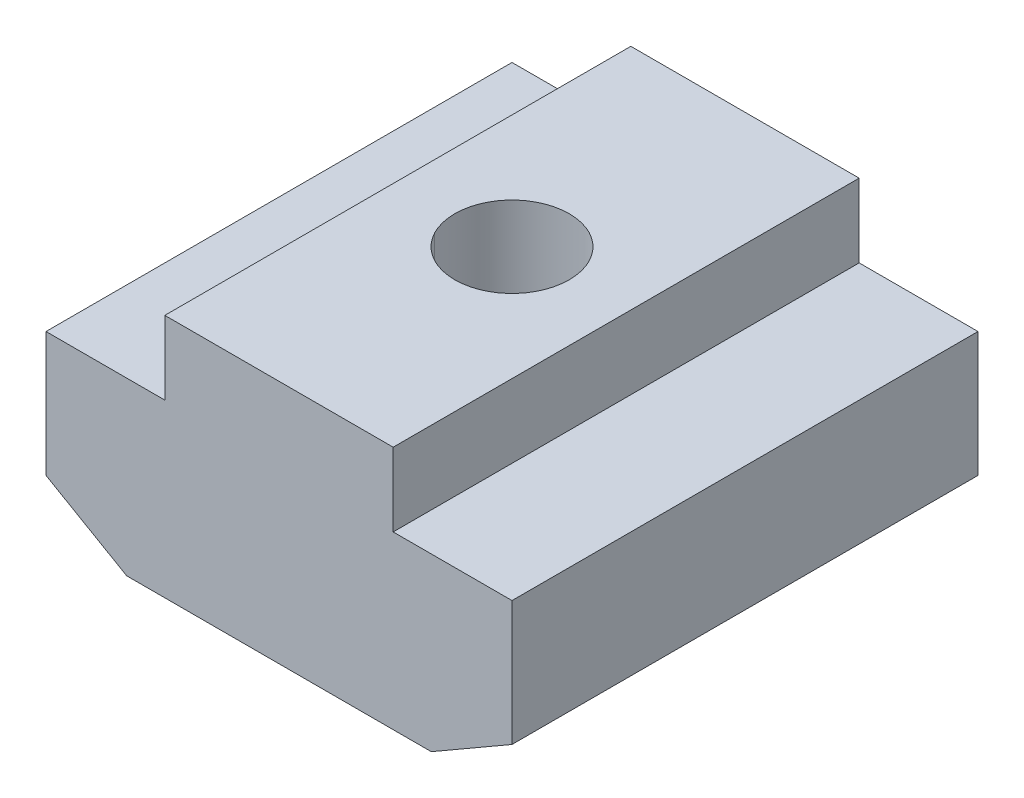
ISO-10303-21;
HEADER;
FILE_DESCRIPTION(('STEP AP214'),'2;1');
FILE_NAME('part.step','',(''),(''),'','','');
FILE_SCHEMA(('AUTOMOTIVE_DESIGN { 1 0 10303 214 1 1 1 1 }'));
ENDSEC;
DATA;
#1=APPLICATION_CONTEXT('core data for automotive mechanical design processes');
#2=APPLICATION_PROTOCOL_DEFINITION('international standard','automotive_design',2000,#1);
#3=PRODUCT_CONTEXT('',#1,'mechanical');
#4=PRODUCT('Part','Part','',(#3));
#5=PRODUCT_RELATED_PRODUCT_CATEGORY('part','',(#4));
#6=PRODUCT_DEFINITION_FORMATION('','',#4);
#7=PRODUCT_DEFINITION_CONTEXT('part definition',#1,'design');
#8=PRODUCT_DEFINITION('design','',#6,#7);
#9=PRODUCT_DEFINITION_SHAPE('','',#8);
#10=(LENGTH_UNIT() NAMED_UNIT(*) SI_UNIT(.MILLI.,.METRE.));
#11=(NAMED_UNIT(*) PLANE_ANGLE_UNIT() SI_UNIT($,.RADIAN.));
#12=(NAMED_UNIT(*) SI_UNIT($,.STERADIAN.) SOLID_ANGLE_UNIT());
#13=UNCERTAINTY_MEASURE_WITH_UNIT(LENGTH_MEASURE(1.E-05),#10,'distance_accuracy_value','');
#14=(GEOMETRIC_REPRESENTATION_CONTEXT(3) GLOBAL_UNCERTAINTY_ASSIGNED_CONTEXT((#13)) GLOBAL_UNIT_ASSIGNED_CONTEXT((#10,
#11,#12)) REPRESENTATION_CONTEXT('',''));
#15=CARTESIAN_POINT('',(0.,0.,0.));
#16=DIRECTION('',(0.,0.,1.));
#17=DIRECTION('',(1.,0.,0.));
#18=AXIS2_PLACEMENT_3D('',#15,#16,#17);
#19=CARTESIAN_POINT('',(-10.,-1.675,0.));
#20=DIRECTION('',(0.50000000000019,0.866025403784329,0.));
#21=DIRECTION('',(0.,0.,-1.));
#22=AXIS2_PLACEMENT_3D('',#19,#20,#21);
#23=PLANE('',#22);
#24=DIRECTION('',(0.,0.,1.));
#25=VECTOR('',#24,1.);
#26=CARTESIAN_POINT('',(-10.,-1.675,0.));
#27=LINE('',#26,#25);
#28=CARTESIAN_POINT('',(-10.,-1.675,-10.));
#29=VERTEX_POINT('',#28);
#30=CARTESIAN_POINT('',(-10.,-1.675,10.));
#31=VERTEX_POINT('',#30);
#32=EDGE_CURVE('E258',#29,#31,#27,.T.);
#33=ORIENTED_EDGE('',*,*,#32,.F.);
#34=DIRECTION('',(0.866025403784329,-0.50000000000019,0.));
#35=VECTOR('',#34,1.);
#36=CARTESIAN_POINT('',(-8.26794919243,-2.675,-10.));
#37=LINE('',#36,#35);
#38=CARTESIAN_POINT('',(-6.53589838486,-3.675,-10.));
#39=VERTEX_POINT('',#38);
#40=EDGE_CURVE('E246',#29,#39,#37,.T.);
#41=ORIENTED_EDGE('',*,*,#40,.T.);
#42=DIRECTION('',(0.,0.,1.));
#43=VECTOR('',#42,1.);
#44=CARTESIAN_POINT('',(-6.53589838486,-3.675,0.));
#45=LINE('',#44,#43);
#46=CARTESIAN_POINT('',(-6.53589838486,-3.675,10.));
#47=VERTEX_POINT('',#46);
#48=EDGE_CURVE('E12',#39,#47,#45,.T.);
#49=ORIENTED_EDGE('',*,*,#48,.T.);
#50=DIRECTION('',(-0.866025403784329,0.50000000000019,0.));
#51=VECTOR('',#50,1.);
#52=CARTESIAN_POINT('',(-8.26794919243,-2.675,10.));
#53=LINE('',#52,#51);
#54=EDGE_CURVE('E30',#47,#31,#53,.T.);
#55=ORIENTED_EDGE('',*,*,#54,.T.);
#56=EDGE_LOOP('',(#33,#41,#49,#55));
#57=FACE_BOUND('',#56,.T.);
#58=ADVANCED_FACE('F20',(#57),#23,.F.);
#59=CARTESIAN_POINT('',(10.,-3.675,0.));
#60=DIRECTION('',(0.,1.,0.));
#61=DIRECTION('',(1.,0.,0.));
#62=AXIS2_PLACEMENT_3D('',#59,#60,#61);
#63=PLANE('',#62);
#64=CARTESIAN_POINT('',(0.,-3.675,0.));
#65=DIRECTION('',(0.,1.,0.));
#66=DIRECTION('',(1.,0.,0.));
#67=AXIS2_PLACEMENT_3D('',#64,#65,#66);
#68=CIRCLE('',#67,3.3235);
#69=CARTESIAN_POINT('',(-3.3235,-3.675,0.));
#70=VERTEX_POINT('',#69);
#71=CARTESIAN_POINT('',(3.3235,-3.675,0.));
#72=VERTEX_POINT('',#71);
#73=EDGE_CURVE('E206',#70,#72,#68,.T.);
#74=ORIENTED_EDGE('',*,*,#73,.T.);
#75=CARTESIAN_POINT('',(0.,-3.675,0.));
#76=DIRECTION('',(0.,1.,0.));
#77=DIRECTION('',(1.,0.,0.));
#78=AXIS2_PLACEMENT_3D('',#75,#76,#77);
#79=CIRCLE('',#78,3.3235);
#80=EDGE_CURVE('E177',#72,#70,#79,.T.);
#81=ORIENTED_EDGE('',*,*,#80,.T.);
#82=EDGE_LOOP('',(#74,#81));
#83=FACE_BOUND('',#82,.T.);
#84=ORIENTED_EDGE('',*,*,#48,.F.);
#85=DIRECTION('',(1.,0.,0.));
#86=VECTOR('',#85,1.);
#87=CARTESIAN_POINT('',(0.,-3.675,-10.));
#88=LINE('',#87,#86);
#89=CARTESIAN_POINT('',(6.53589838486,-3.675,-10.));
#90=VERTEX_POINT('',#89);
#91=EDGE_CURVE('E244',#39,#90,#88,.T.);
#92=ORIENTED_EDGE('',*,*,#91,.T.);
#93=DIRECTION('',(0.,0.,1.));
#94=VECTOR('',#93,1.);
#95=CARTESIAN_POINT('',(6.53589838486,-3.675,0.));
#96=LINE('',#95,#94);
#97=CARTESIAN_POINT('',(6.53589838486,-3.675,10.));
#98=VERTEX_POINT('',#97);
#99=EDGE_CURVE('E267',#90,#98,#96,.T.);
#100=ORIENTED_EDGE('',*,*,#99,.T.);
#101=DIRECTION('',(1.,0.,0.));
#102=VECTOR('',#101,1.);
#103=CARTESIAN_POINT('',(0.,-3.675,10.));
#104=LINE('',#103,#102);
#105=EDGE_CURVE('E240',#47,#98,#104,.T.);
#106=ORIENTED_EDGE('',*,*,#105,.F.);
#107=EDGE_LOOP('',(#84,#92,#100,#106));
#108=FACE_BOUND('',#107,.T.);
#109=ADVANCED_FACE('F223',(#83,#108),#63,.F.);
#110=CARTESIAN_POINT('',(0.,0.,10.));
#111=DIRECTION('',(0.,0.,1.));
#112=DIRECTION('',(1.,0.,0.));
#113=AXIS2_PLACEMENT_3D('',#110,#111,#112);
#114=PLANE('',#113);
#115=ORIENTED_EDGE('',*,*,#105,.T.);
#116=DIRECTION('',(-0.866025403784329,-0.50000000000019,0.));
#117=VECTOR('',#116,1.);
#118=CARTESIAN_POINT('',(8.26794919243,-2.675,10.));
#119=LINE('',#118,#117);
#120=CARTESIAN_POINT('',(10.,-1.675,10.));
#121=VERTEX_POINT('',#120);
#122=EDGE_CURVE('E263',#121,#98,#119,.T.);
#123=ORIENTED_EDGE('',*,*,#122,.F.);
#124=DIRECTION('',(0.,1.,0.));
#125=VECTOR('',#124,1.);
#126=CARTESIAN_POINT('',(10.,1.,10.));
#127=LINE('',#126,#125);
#128=CARTESIAN_POINT('',(10.,3.675,10.));
#129=VERTEX_POINT('',#128);
#130=EDGE_CURVE('E272',#121,#129,#127,.T.);
#131=ORIENTED_EDGE('',*,*,#130,.T.);
#132=DIRECTION('',(-1.,0.,0.));
#133=VECTOR('',#132,1.);
#134=CARTESIAN_POINT('',(7.45,3.675,10.));
#135=LINE('',#134,#133);
#136=CARTESIAN_POINT('',(4.9,3.675,10.));
#137=VERTEX_POINT('',#136);
#138=EDGE_CURVE('E199',#129,#137,#135,.T.);
#139=ORIENTED_EDGE('',*,*,#138,.T.);
#140=DIRECTION('',(0.,1.,0.));
#141=VECTOR('',#140,1.);
#142=CARTESIAN_POINT('',(4.9,5.25,10.));
#143=LINE('',#142,#141);
#144=CARTESIAN_POINT('',(4.9,6.825,10.));
#145=VERTEX_POINT('',#144);
#146=EDGE_CURVE('E284',#137,#145,#143,.T.);
#147=ORIENTED_EDGE('',*,*,#146,.T.);
#148=DIRECTION('',(-1.,0.,0.));
#149=VECTOR('',#148,1.);
#150=CARTESIAN_POINT('',(0.,6.825,10.));
#151=LINE('',#150,#149);
#152=CARTESIAN_POINT('',(-4.9,6.825,10.));
#153=VERTEX_POINT('',#152);
#154=EDGE_CURVE('E278',#145,#153,#151,.T.);
#155=ORIENTED_EDGE('',*,*,#154,.T.);
#156=DIRECTION('',(0.,-1.,0.));
#157=VECTOR('',#156,1.);
#158=CARTESIAN_POINT('',(-4.9,5.25,10.));
#159=LINE('',#158,#157);
#160=CARTESIAN_POINT('',(-4.9,3.675,10.));
#161=VERTEX_POINT('',#160);
#162=EDGE_CURVE('E298',#153,#161,#159,.T.);
#163=ORIENTED_EDGE('',*,*,#162,.T.);
#164=DIRECTION('',(-1.,0.,0.));
#165=VECTOR('',#164,1.);
#166=CARTESIAN_POINT('',(-7.45,3.675,10.));
#167=LINE('',#166,#165);
#168=CARTESIAN_POINT('',(-10.,3.675,10.));
#169=VERTEX_POINT('',#168);
#170=EDGE_CURVE('E308',#161,#169,#167,.T.);
#171=ORIENTED_EDGE('',*,*,#170,.T.);
#172=DIRECTION('',(0.,-1.,0.));
#173=VECTOR('',#172,1.);
#174=CARTESIAN_POINT('',(-10.,1.,10.));
#175=LINE('',#174,#173);
#176=EDGE_CURVE('E254',#169,#31,#175,.T.);
#177=ORIENTED_EDGE('',*,*,#176,.T.);
#178=ORIENTED_EDGE('',*,*,#54,.F.);
#179=EDGE_LOOP('',(#115,#123,#131,#139,#147,#155,#163,#171,#177,#178));
#180=FACE_BOUND('',#179,.T.);
#181=ADVANCED_FACE('F467',(#180),#114,.T.);
#182=CARTESIAN_POINT('',(0.,0.,-10.));
#183=DIRECTION('',(0.,0.,1.));
#184=DIRECTION('',(1.,0.,0.));
#185=AXIS2_PLACEMENT_3D('',#182,#183,#184);
#186=PLANE('',#185);
#187=ORIENTED_EDGE('',*,*,#40,.F.);
#188=DIRECTION('',(0.,-1.,0.));
#189=VECTOR('',#188,1.);
#190=CARTESIAN_POINT('',(-10.,1.,-10.));
#191=LINE('',#190,#189);
#192=CARTESIAN_POINT('',(-10.,3.675,-10.));
#193=VERTEX_POINT('',#192);
#194=EDGE_CURVE('E250',#193,#29,#191,.T.);
#195=ORIENTED_EDGE('',*,*,#194,.F.);
#196=DIRECTION('',(-1.,0.,0.));
#197=VECTOR('',#196,1.);
#198=CARTESIAN_POINT('',(-7.45,3.675,-10.));
#199=LINE('',#198,#197);
#200=CARTESIAN_POINT('',(-4.9,3.675,-10.));
#201=VERTEX_POINT('',#200);
#202=EDGE_CURVE('E316',#201,#193,#199,.T.);
#203=ORIENTED_EDGE('',*,*,#202,.F.);
#204=DIRECTION('',(0.,-1.,0.));
#205=VECTOR('',#204,1.);
#206=CARTESIAN_POINT('',(-4.9,5.25,-10.));
#207=LINE('',#206,#205);
#208=CARTESIAN_POINT('',(-4.9,6.825,-10.));
#209=VERTEX_POINT('',#208);
#210=EDGE_CURVE('E301',#209,#201,#207,.T.);
#211=ORIENTED_EDGE('',*,*,#210,.F.);
#212=DIRECTION('',(-1.,0.,0.));
#213=VECTOR('',#212,1.);
#214=CARTESIAN_POINT('',(0.,6.825,-10.));
#215=LINE('',#214,#213);
#216=CARTESIAN_POINT('',(4.9,6.825,-10.));
#217=VERTEX_POINT('',#216);
#218=EDGE_CURVE('E281',#217,#209,#215,.T.);
#219=ORIENTED_EDGE('',*,*,#218,.F.);
#220=DIRECTION('',(0.,1.,0.));
#221=VECTOR('',#220,1.);
#222=CARTESIAN_POINT('',(4.9,5.25,-10.));
#223=LINE('',#222,#221);
#224=CARTESIAN_POINT('',(4.9,3.675,-10.));
#225=VERTEX_POINT('',#224);
#226=EDGE_CURVE('E292',#225,#217,#223,.T.);
#227=ORIENTED_EDGE('',*,*,#226,.F.);
#228=DIRECTION('',(-1.,0.,0.));
#229=VECTOR('',#228,1.);
#230=CARTESIAN_POINT('',(7.45,3.675,-10.));
#231=LINE('',#230,#229);
#232=CARTESIAN_POINT('',(10.,3.675,-10.));
#233=VERTEX_POINT('',#232);
#234=EDGE_CURVE('E200',#233,#225,#231,.T.);
#235=ORIENTED_EDGE('',*,*,#234,.F.);
#236=DIRECTION('',(0.,1.,0.));
#237=VECTOR('',#236,1.);
#238=CARTESIAN_POINT('',(10.,1.,-10.));
#239=LINE('',#238,#237);
#240=CARTESIAN_POINT('',(10.,-1.675,-10.));
#241=VERTEX_POINT('',#240);
#242=EDGE_CURVE('E182',#241,#233,#239,.T.);
#243=ORIENTED_EDGE('',*,*,#242,.F.);
#244=DIRECTION('',(0.866025403784329,0.50000000000019,0.));
#245=VECTOR('',#244,1.);
#246=CARTESIAN_POINT('',(8.26794919243,-2.675,-10.));
#247=LINE('',#246,#245);
#248=EDGE_CURVE('E264',#90,#241,#247,.T.);
#249=ORIENTED_EDGE('',*,*,#248,.F.);
#250=ORIENTED_EDGE('',*,*,#91,.F.);
#251=EDGE_LOOP('',(#187,#195,#203,#211,#219,#227,#235,#243,#249,#250));
#252=FACE_BOUND('',#251,.T.);
#253=ADVANCED_FACE('F22',(#252),#186,.F.);
#254=CARTESIAN_POINT('',(-10.,-3.675,0.));
#255=DIRECTION('',(1.,0.,0.));
#256=DIRECTION('',(0.,1.,0.));
#257=AXIS2_PLACEMENT_3D('',#254,#255,#256);
#258=PLANE('',#257);
#259=ORIENTED_EDGE('',*,*,#32,.T.);
#260=ORIENTED_EDGE('',*,*,#176,.F.);
#261=DIRECTION('',(0.,0.,1.));
#262=VECTOR('',#261,1.);
#263=CARTESIAN_POINT('',(-10.,3.675,0.));
#264=LINE('',#263,#262);
#265=EDGE_CURVE('E312',#193,#169,#264,.T.);
#266=ORIENTED_EDGE('',*,*,#265,.F.);
#267=ORIENTED_EDGE('',*,*,#194,.T.);
#268=EDGE_LOOP('',(#259,#260,#266,#267));
#269=FACE_BOUND('',#268,.T.);
#270=ADVANCED_FACE('F537',(#269),#258,.F.);
#271=CARTESIAN_POINT('',(10.,-1.675,0.));
#272=DIRECTION('',(-0.50000000000019,0.866025403784329,0.));
#273=DIRECTION('',(0.,0.,1.));
#274=AXIS2_PLACEMENT_3D('',#271,#272,#273);
#275=PLANE('',#274);
#276=ORIENTED_EDGE('',*,*,#99,.F.);
#277=ORIENTED_EDGE('',*,*,#248,.T.);
#278=DIRECTION('',(0.,0.,1.));
#279=VECTOR('',#278,1.);
#280=CARTESIAN_POINT('',(10.,-1.675,0.));
#281=LINE('',#280,#279);
#282=EDGE_CURVE('E273',#241,#121,#281,.T.);
#283=ORIENTED_EDGE('',*,*,#282,.T.);
#284=ORIENTED_EDGE('',*,*,#122,.T.);
#285=EDGE_LOOP('',(#276,#277,#283,#284));
#286=FACE_BOUND('',#285,.T.);
#287=ADVANCED_FACE('F533',(#286),#275,.F.);
#288=CARTESIAN_POINT('',(10.,3.675,0.));
#289=DIRECTION('',(-1.,0.,0.));
#290=DIRECTION('',(0.,0.,1.));
#291=AXIS2_PLACEMENT_3D('',#288,#289,#290);
#292=PLANE('',#291);
#293=ORIENTED_EDGE('',*,*,#282,.F.);
#294=ORIENTED_EDGE('',*,*,#242,.T.);
#295=DIRECTION('',(0.,0.,1.));
#296=VECTOR('',#295,1.);
#297=CARTESIAN_POINT('',(10.,3.675,0.));
#298=LINE('',#297,#296);
#299=EDGE_CURVE('E156',#233,#129,#298,.T.);
#300=ORIENTED_EDGE('',*,*,#299,.T.);
#301=ORIENTED_EDGE('',*,*,#130,.F.);
#302=EDGE_LOOP('',(#293,#294,#300,#301));
#303=FACE_BOUND('',#302,.T.);
#304=ADVANCED_FACE('F344',(#303),#292,.F.);
#305=CARTESIAN_POINT('',(-4.9,6.825,0.));
#306=DIRECTION('',(0.,-1.,0.));
#307=DIRECTION('',(0.,0.,-1.));
#308=AXIS2_PLACEMENT_3D('',#305,#306,#307);
#309=PLANE('',#308);
#310=CARTESIAN_POINT('',(0.,6.825,0.));
#311=DIRECTION('',(0.,-1.,0.));
#312=DIRECTION('',(1.,0.,0.));
#313=AXIS2_PLACEMENT_3D('',#310,#311,#312);
#314=CIRCLE('',#313,2.45747459622);
#315=CARTESIAN_POINT('',(2.45747459622,6.825,0.));
#316=VERTEX_POINT('',#315);
#317=CARTESIAN_POINT('',(-2.45747459622,6.825,0.));
#318=VERTEX_POINT('',#317);
#319=EDGE_CURVE('E161',#316,#318,#314,.T.);
#320=ORIENTED_EDGE('',*,*,#319,.T.);
#321=CARTESIAN_POINT('',(0.,6.825,0.));
#322=DIRECTION('',(0.,-1.,0.));
#323=DIRECTION('',(1.,0.,0.));
#324=AXIS2_PLACEMENT_3D('',#321,#322,#323);
#325=CIRCLE('',#324,2.45747459622);
#326=EDGE_CURVE('E145',#318,#316,#325,.T.);
#327=ORIENTED_EDGE('',*,*,#326,.T.);
#328=EDGE_LOOP('',(#320,#327));
#329=FACE_BOUND('',#328,.T.);
#330=DIRECTION('',(0.,0.,1.));
#331=VECTOR('',#330,1.);
#332=CARTESIAN_POINT('',(4.9,6.825,0.));
#333=LINE('',#332,#331);
#334=EDGE_CURVE('E287',#217,#145,#333,.T.);
#335=ORIENTED_EDGE('',*,*,#334,.F.);
#336=ORIENTED_EDGE('',*,*,#218,.T.);
#337=DIRECTION('',(0.,0.,1.));
#338=VECTOR('',#337,1.);
#339=CARTESIAN_POINT('',(-4.9,6.825,0.));
#340=LINE('',#339,#338);
#341=EDGE_CURVE('E303',#209,#153,#340,.T.);
#342=ORIENTED_EDGE('',*,*,#341,.T.);
#343=ORIENTED_EDGE('',*,*,#154,.F.);
#344=EDGE_LOOP('',(#335,#336,#342,#343));
#345=FACE_BOUND('',#344,.T.);
#346=ADVANCED_FACE('F167',(#329,#345),#309,.F.);
#347=CARTESIAN_POINT('',(4.9,6.825,0.));
#348=DIRECTION('',(-1.,0.,0.));
#349=DIRECTION('',(0.,0.,1.));
#350=AXIS2_PLACEMENT_3D('',#347,#348,#349);
#351=PLANE('',#350);
#352=DIRECTION('',(0.,0.,1.));
#353=VECTOR('',#352,1.);
#354=CARTESIAN_POINT('',(4.9,3.675,0.));
#355=LINE('',#354,#353);
#356=EDGE_CURVE('E193',#225,#137,#355,.T.);
#357=ORIENTED_EDGE('',*,*,#356,.F.);
#358=ORIENTED_EDGE('',*,*,#226,.T.);
#359=ORIENTED_EDGE('',*,*,#334,.T.);
#360=ORIENTED_EDGE('',*,*,#146,.F.);
#361=EDGE_LOOP('',(#357,#358,#359,#360));
#362=FACE_BOUND('',#361,.T.);
#363=ADVANCED_FACE('F498',(#362),#351,.F.);
#364=CARTESIAN_POINT('',(-4.9,3.675,0.));
#365=DIRECTION('',(1.,0.,0.));
#366=DIRECTION('',(0.,1.,0.));
#367=AXIS2_PLACEMENT_3D('',#364,#365,#366);
#368=PLANE('',#367);
#369=ORIENTED_EDGE('',*,*,#341,.F.);
#370=ORIENTED_EDGE('',*,*,#210,.T.);
#371=DIRECTION('',(0.,0.,1.));
#372=VECTOR('',#371,1.);
#373=CARTESIAN_POINT('',(-4.9,3.675,0.));
#374=LINE('',#373,#372);
#375=EDGE_CURVE('E317',#201,#161,#374,.T.);
#376=ORIENTED_EDGE('',*,*,#375,.T.);
#377=ORIENTED_EDGE('',*,*,#162,.F.);
#378=EDGE_LOOP('',(#369,#370,#376,#377));
#379=FACE_BOUND('',#378,.T.);
#380=ADVANCED_FACE('F487',(#379),#368,.F.);
#381=CARTESIAN_POINT('',(4.9,3.675,0.));
#382=DIRECTION('',(0.,-1.,0.));
#383=DIRECTION('',(0.,0.,-1.));
#384=AXIS2_PLACEMENT_3D('',#381,#382,#383);
#385=PLANE('',#384);
#386=ORIENTED_EDGE('',*,*,#375,.F.);
#387=ORIENTED_EDGE('',*,*,#202,.T.);
#388=ORIENTED_EDGE('',*,*,#265,.T.);
#389=ORIENTED_EDGE('',*,*,#170,.F.);
#390=EDGE_LOOP('',(#386,#387,#388,#389));
#391=FACE_BOUND('',#390,.T.);
#392=ADVANCED_FACE('F477',(#391),#385,.F.);
#393=CARTESIAN_POINT('',(4.9,3.675,0.));
#394=DIRECTION('',(0.,-1.,0.));
#395=DIRECTION('',(0.,0.,-1.));
#396=AXIS2_PLACEMENT_3D('',#393,#394,#395);
#397=PLANE('',#396);
#398=ORIENTED_EDGE('',*,*,#299,.F.);
#399=ORIENTED_EDGE('',*,*,#234,.T.);
#400=ORIENTED_EDGE('',*,*,#356,.T.);
#401=ORIENTED_EDGE('',*,*,#138,.F.);
#402=EDGE_LOOP('',(#398,#399,#400,#401));
#403=FACE_BOUND('',#402,.T.);
#404=ADVANCED_FACE('F352',(#403),#397,.F.);
#405=CARTESIAN_POINT('',(0.,7.24382361965,0.));
#406=DIRECTION('',(0.,-1.,0.));
#407=DIRECTION('',(1.,0.,0.));
#408=AXIS2_PLACEMENT_3D('',#405,#406,#407);
#409=CONICAL_SURFACE('',#408,1.73205080758248,1.0471975512);
#410=ORIENTED_EDGE('',*,*,#326,.F.);
#411=DIRECTION('',(-0.866025403784329,-0.50000000000019,0.));
#412=VECTOR('',#411,1.);
#413=CARTESIAN_POINT('',(-1.66175,7.28441180983,0.));
#414=LINE('',#413,#412);
#415=CARTESIAN_POINT('',(-3.3235,6.325,0.));
#416=VERTEX_POINT('',#415);
#417=EDGE_CURVE('E149',#318,#416,#414,.T.);
#418=ORIENTED_EDGE('',*,*,#417,.T.);
#419=CARTESIAN_POINT('',(0.,6.325,0.));
#420=DIRECTION('',(0.,1.,0.));
#421=DIRECTION('',(1.,0.,0.));
#422=AXIS2_PLACEMENT_3D('',#419,#420,#421);
#423=CIRCLE('',#422,3.3235);
#424=CARTESIAN_POINT('',(3.3235,6.325,0.));
#425=VERTEX_POINT('',#424);
#426=EDGE_CURVE('E170',#425,#416,#423,.T.);
#427=ORIENTED_EDGE('',*,*,#426,.F.);
#428=DIRECTION('',(0.866025403784329,-0.50000000000019,0.));
#429=VECTOR('',#428,1.);
#430=CARTESIAN_POINT('',(1.66175,7.28441180983,0.));
#431=LINE('',#430,#429);
#432=EDGE_CURVE('E151',#316,#425,#431,.T.);
#433=ORIENTED_EDGE('',*,*,#432,.F.);
#434=EDGE_LOOP('',(#410,#418,#427,#433));
#435=FACE_BOUND('',#434,.T.);
#436=ADVANCED_FACE('F147',(#435),#409,.F.);
#437=CARTESIAN_POINT('',(0.,7.24382361965,0.));
#438=DIRECTION('',(0.,-1.,0.));
#439=DIRECTION('',(1.,0.,0.));
#440=AXIS2_PLACEMENT_3D('',#437,#438,#439);
#441=CONICAL_SURFACE('',#440,1.73205080758248,1.0471975512);
#442=ORIENTED_EDGE('',*,*,#319,.F.);
#443=ORIENTED_EDGE('',*,*,#432,.T.);
#444=CARTESIAN_POINT('',(0.,6.325,0.));
#445=DIRECTION('',(0.,1.,0.));
#446=DIRECTION('',(1.,0.,0.));
#447=AXIS2_PLACEMENT_3D('',#444,#445,#446);
#448=CIRCLE('',#447,3.3235);
#449=EDGE_CURVE('E163',#416,#425,#448,.T.);
#450=ORIENTED_EDGE('',*,*,#449,.F.);
#451=ORIENTED_EDGE('',*,*,#417,.F.);
#452=EDGE_LOOP('',(#442,#443,#450,#451));
#453=FACE_BOUND('',#452,.T.);
#454=ADVANCED_FACE('F160',(#453),#441,.F.);
#455=CARTESIAN_POINT('',(0.,-3.675,0.));
#456=DIRECTION('',(0.,1.,0.));
#457=DIRECTION('',(1.,0.,0.));
#458=AXIS2_PLACEMENT_3D('',#455,#456,#457);
#459=CYLINDRICAL_SURFACE('',#458,3.3235);
#460=ORIENTED_EDGE('',*,*,#80,.F.);
#461=DIRECTION('',(0.,-1.,0.));
#462=VECTOR('',#461,1.);
#463=CARTESIAN_POINT('',(3.3235,1.16999999996,0.));
#464=LINE('',#463,#462);
#465=EDGE_CURVE('E213',#425,#72,#464,.T.);
#466=ORIENTED_EDGE('',*,*,#465,.F.);
#467=ORIENTED_EDGE('',*,*,#426,.T.);
#468=DIRECTION('',(0.,-1.,0.));
#469=VECTOR('',#468,1.);
#470=CARTESIAN_POINT('',(-3.3235,1.16999999996,0.));
#471=LINE('',#470,#469);
#472=EDGE_CURVE('E202',#416,#70,#471,.T.);
#473=ORIENTED_EDGE('',*,*,#472,.T.);
#474=EDGE_LOOP('',(#460,#466,#467,#473));
#475=FACE_BOUND('',#474,.T.);
#476=ADVANCED_FACE('F227',(#475),#459,.F.);
#477=CARTESIAN_POINT('',(0.,-3.675,0.));
#478=DIRECTION('',(0.,1.,0.));
#479=DIRECTION('',(1.,0.,0.));
#480=AXIS2_PLACEMENT_3D('',#477,#478,#479);
#481=CYLINDRICAL_SURFACE('',#480,3.3235);
#482=ORIENTED_EDGE('',*,*,#73,.F.);
#483=ORIENTED_EDGE('',*,*,#472,.F.);
#484=ORIENTED_EDGE('',*,*,#449,.T.);
#485=ORIENTED_EDGE('',*,*,#465,.T.);
#486=EDGE_LOOP('',(#482,#483,#484,#485));
#487=FACE_BOUND('',#486,.T.);
#488=ADVANCED_FACE('F229',(#487),#481,.F.);
#489=CLOSED_SHELL('',(#58,#109,#181,#253,#270,#287,#304,#346,#363,#380,#392,#404,#436,#454,#476,#488));
#490=MANIFOLD_SOLID_BREP('B1',#489);
#491=ADVANCED_BREP_SHAPE_REPRESENTATION('',(#18,#490),#14);
#492=SHAPE_DEFINITION_REPRESENTATION(#9,#491);
ENDSEC;
END-ISO-10303-21;
